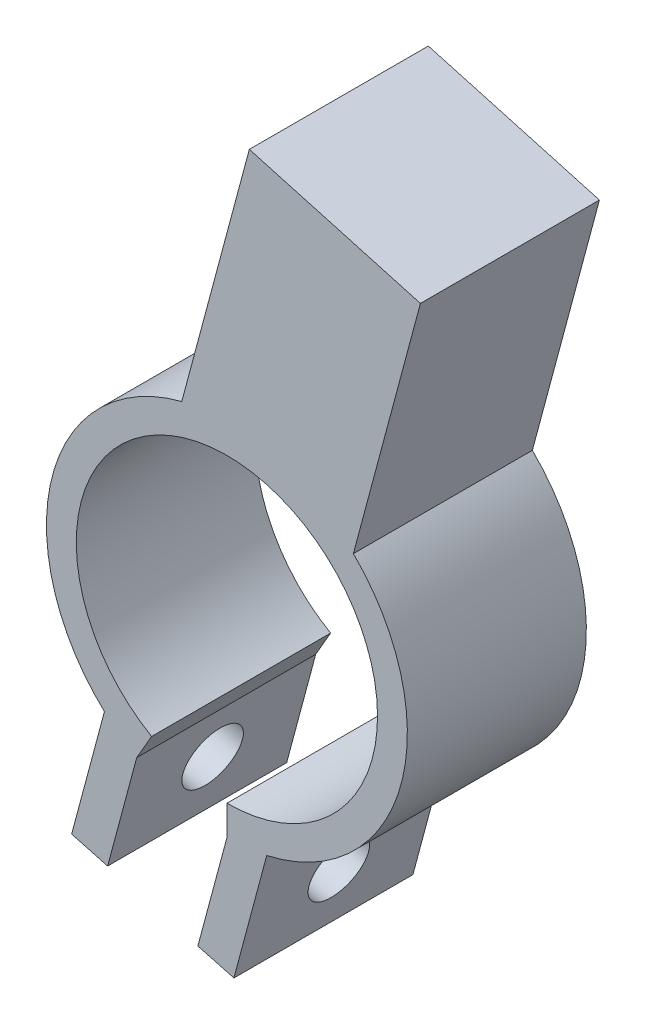
ISO-10303-21;
HEADER;
FILE_DESCRIPTION(('STEP AP214'),'2;1');
FILE_NAME('part.step','',(''),(''),'','','');
FILE_SCHEMA(('AUTOMOTIVE_DESIGN { 1 0 10303 214 1 1 1 1 }'));
ENDSEC;
DATA;
#1=APPLICATION_CONTEXT('core data for automotive mechanical design processes');
#2=APPLICATION_PROTOCOL_DEFINITION('international standard','automotive_design',2000,#1);
#3=PRODUCT_CONTEXT('',#1,'mechanical');
#4=PRODUCT('Part','Part','',(#3));
#5=PRODUCT_RELATED_PRODUCT_CATEGORY('part','',(#4));
#6=PRODUCT_DEFINITION_FORMATION('','',#4);
#7=PRODUCT_DEFINITION_CONTEXT('part definition',#1,'design');
#8=PRODUCT_DEFINITION('design','',#6,#7);
#9=PRODUCT_DEFINITION_SHAPE('','',#8);
#10=(LENGTH_UNIT() NAMED_UNIT(*) SI_UNIT(.MILLI.,.METRE.));
#11=(NAMED_UNIT(*) PLANE_ANGLE_UNIT() SI_UNIT($,.RADIAN.));
#12=(NAMED_UNIT(*) SI_UNIT($,.STERADIAN.) SOLID_ANGLE_UNIT());
#13=UNCERTAINTY_MEASURE_WITH_UNIT(LENGTH_MEASURE(1.E-05),#10,'distance_accuracy_value','');
#14=(GEOMETRIC_REPRESENTATION_CONTEXT(3) GLOBAL_UNCERTAINTY_ASSIGNED_CONTEXT((#13)) GLOBAL_UNIT_ASSIGNED_CONTEXT((#10,
#11,#12)) REPRESENTATION_CONTEXT('',''));
#15=CARTESIAN_POINT('',(0.,0.,0.));
#16=DIRECTION('',(0.,0.,1.));
#17=DIRECTION('',(1.,0.,0.));
#18=AXIS2_PLACEMENT_3D('',#15,#16,#17);
#19=CARTESIAN_POINT('',(0.,0.,24.));
#20=DIRECTION('',(0.,0.,-1.));
#21=DIRECTION('',(-1.,0.,0.));
#22=AXIS2_PLACEMENT_3D('',#19,#20,#21);
#23=CYLINDRICAL_SURFACE('',#22,24.193);
#24=CARTESIAN_POINT('',(0.,0.,0.));
#25=DIRECTION('',(0.,0.,1.));
#26=DIRECTION('',(1.,0.,0.));
#27=AXIS2_PLACEMENT_3D('',#24,#25,#26);
#28=CIRCLE('',#27,24.193);
#29=CARTESIAN_POINT('',(5.3360235923067,-23.5972053689064,0.));
#30=VERTEX_POINT('',#29);
#31=CARTESIAN_POINT('',(16.9534083986273,17.2592929365416,0.));
#32=VERTEX_POINT('',#31);
#33=EDGE_CURVE('E247',#30,#32,#28,.T.);
#34=ORIENTED_EDGE('',*,*,#33,.T.);
#35=DIRECTION('',(0.,0.,1.));
#36=VECTOR('',#35,1.);
#37=CARTESIAN_POINT('',(16.9534083986273,17.2592929365416,0.));
#38=LINE('',#37,#36);
#39=CARTESIAN_POINT('',(16.9534083986273,17.2592929365416,24.));
#40=VERTEX_POINT('',#39);
#41=EDGE_CURVE('E58',#32,#40,#38,.T.);
#42=ORIENTED_EDGE('',*,*,#41,.T.);
#43=CARTESIAN_POINT('',(0.,0.,24.));
#44=DIRECTION('',(0.,0.,1.));
#45=DIRECTION('',(1.,0.,0.));
#46=AXIS2_PLACEMENT_3D('',#43,#44,#45);
#47=CIRCLE('',#46,24.193);
#48=CARTESIAN_POINT('',(5.3360235923067,-23.5972053689064,24.));
#49=VERTEX_POINT('',#48);
#50=EDGE_CURVE('E245',#49,#40,#47,.T.);
#51=ORIENTED_EDGE('',*,*,#50,.F.);
#52=DIRECTION('',(0.,0.,1.));
#53=VECTOR('',#52,1.);
#54=CARTESIAN_POINT('',(5.3360235923067,-23.5972053689064,0.));
#55=LINE('',#54,#53);
#56=EDGE_CURVE('E196',#30,#49,#55,.T.);
#57=ORIENTED_EDGE('',*,*,#56,.F.);
#58=EDGE_LOOP('',(#34,#42,#51,#57));
#59=FACE_BOUND('',#58,.T.);
#60=ADVANCED_FACE('F34',(#59),#23,.T.);
#61=CARTESIAN_POINT('',(-6.05243588567291,23.423690333716,24.));
#62=VERTEX_POINT('',#61);
#63=CARTESIAN_POINT('',(-16.419734670584,-17.7677675116381,24.));
#64=VERTEX_POINT('',#63);
#65=EDGE_CURVE('E50',#62,#64,#47,.T.);
#66=ORIENTED_EDGE('',*,*,#65,.F.);
#67=DIRECTION('',(0.,0.,1.));
#68=VECTOR('',#67,1.);
#69=CARTESIAN_POINT('',(-6.05243588567286,23.423690333716,0.));
#70=LINE('',#69,#68);
#71=CARTESIAN_POINT('',(-6.05243588567286,23.423690333716,0.));
#72=VERTEX_POINT('',#71);
#73=EDGE_CURVE('E147',#72,#62,#70,.T.);
#74=ORIENTED_EDGE('',*,*,#73,.F.);
#75=CARTESIAN_POINT('',(-16.419734670584,-17.7677675116381,0.));
#76=VERTEX_POINT('',#75);
#77=EDGE_CURVE('E158',#72,#76,#28,.T.);
#78=ORIENTED_EDGE('',*,*,#77,.T.);
#79=DIRECTION('',(0.,0.,1.));
#80=VECTOR('',#79,1.);
#81=CARTESIAN_POINT('',(-16.419734670584,-17.7677675116381,0.));
#82=LINE('',#81,#80);
#83=EDGE_CURVE('E217',#76,#64,#82,.T.);
#84=ORIENTED_EDGE('',*,*,#83,.T.);
#85=EDGE_LOOP('',(#66,#74,#78,#84));
#86=FACE_BOUND('',#85,.T.);
#87=ADVANCED_FACE('F36',(#86),#23,.T.);
#88=CARTESIAN_POINT('',(0.,0.,24.));
#89=DIRECTION('',(0.,0.,1.));
#90=DIRECTION('',(1.,0.,0.));
#91=AXIS2_PLACEMENT_3D('',#88,#89,#90);
#92=PLANE('',#91);
#93=DIRECTION('',(-0.500000000000001,-0.866025403784438,0.));
#94=VECTOR('',#93,1.);
#95=CARTESIAN_POINT('',(-12.0965,-20.9517525937569,24.));
#96=LINE('',#95,#94);
#97=CARTESIAN_POINT('',(-10.0965,-17.4876509786192,24.));
#98=VERTEX_POINT('',#97);
#99=CARTESIAN_POINT('',(-12.0965,-20.9517525937569,24.));
#100=VERTEX_POINT('',#99);
#101=EDGE_CURVE('E229',#98,#100,#96,.T.);
#102=ORIENTED_EDGE('',*,*,#101,.F.);
#103=CARTESIAN_POINT('',(0.,0.,24.));
#104=DIRECTION('',(0.,0.,1.));
#105=DIRECTION('',(1.,0.,0.));
#106=AXIS2_PLACEMENT_3D('',#103,#104,#105);
#107=CIRCLE('',#106,20.193);
#108=CARTESIAN_POINT('',(0.,-20.193,24.));
#109=VERTEX_POINT('',#108);
#110=EDGE_CURVE('E241',#109,#98,#107,.T.);
#111=ORIENTED_EDGE('',*,*,#110,.F.);
#112=DIRECTION('',(0.,1.,0.));
#113=VECTOR('',#112,1.);
#114=CARTESIAN_POINT('',(0.,-24.193,24.));
#115=LINE('',#114,#113);
#116=CARTESIAN_POINT('',(0.,-24.193,24.));
#117=VERTEX_POINT('',#116);
#118=EDGE_CURVE('E219',#117,#109,#115,.T.);
#119=ORIENTED_EDGE('',*,*,#118,.F.);
#120=DIRECTION('',(0.258819045102521,0.965925826289068,0.));
#121=VECTOR('',#120,1.);
#122=CARTESIAN_POINT('',(6.04825000000001,-1.62062370312154,24.));
#123=LINE('',#122,#121);
#124=CARTESIAN_POINT('',(-3.89352930588146,-38.723849190308,24.));
#125=VERTEX_POINT('',#124);
#126=EDGE_CURVE('E183',#125,#117,#123,.T.);
#127=ORIENTED_EDGE('',*,*,#126,.F.);
#128=DIRECTION('',(-0.965925826289068,0.258819045102521,0.));
#129=VECTOR('',#128,1.);
#130=CARTESIAN_POINT('',(-9.94177930588146,-37.1032254871864,24.));
#131=LINE('',#130,#129);
#132=CARTESIAN_POINT('',(0.93609982556388,-40.0179444158206,24.));
#133=VERTEX_POINT('',#132);
#134=EDGE_CURVE('E193',#133,#125,#131,.T.);
#135=ORIENTED_EDGE('',*,*,#134,.F.);
#136=DIRECTION('',(-0.258819045102521,-0.965925826289068,0.));
#137=VECTOR('',#136,1.);
#138=CARTESIAN_POINT('',(10.8778791314454,-2.91471892863415,24.));
#139=LINE('',#138,#137);
#140=EDGE_CURVE('E187',#49,#133,#139,.T.);
#141=ORIENTED_EDGE('',*,*,#140,.F.);
#142=ORIENTED_EDGE('',*,*,#50,.T.);
#143=DIRECTION('',(0.258819045102521,0.965925826289069,0.));
#144=VECTOR('',#143,1.);
#145=CARTESIAN_POINT('',(11.5029221421501,-3.0821986985872,24.));
#146=LINE('',#145,#144);
#147=CARTESIAN_POINT('',(25.9448975350987,50.8159872295567,24.));
#148=VERTEX_POINT('',#147);
#149=EDGE_CURVE('E162',#40,#148,#146,.T.);
#150=ORIENTED_EDGE('',*,*,#149,.T.);
#151=DIRECTION('',(-0.963048123550822,0.269329374048286,0.));
#152=VECTOR('',#151,1.);
#153=CARTESIAN_POINT('',(15.0625049204434,53.8593948427154,24.));
#154=LINE('',#153,#152);
#155=CARTESIAN_POINT('',(3.00623069291536,57.2310942538334,24.));
#156=VERTEX_POINT('',#155);
#157=EDGE_CURVE('E168',#148,#156,#154,.T.);
#158=ORIENTED_EDGE('',*,*,#157,.T.);
#159=DIRECTION('',(-0.258819045102521,-0.965925826289069,0.));
#160=VECTOR('',#159,1.);
#161=CARTESIAN_POINT('',(-11.5029221421501,3.08219869858722,24.));
#162=LINE('',#161,#160);
#163=EDGE_CURVE('E142',#156,#62,#162,.T.);
#164=ORIENTED_EDGE('',*,*,#163,.T.);
#165=ORIENTED_EDGE('',*,*,#65,.T.);
#166=DIRECTION('',(0.258819045102521,0.965925826289068,0.));
#167=VECTOR('',#166,1.);
#168=CARTESIAN_POINT('',(-10.8778791314454,2.91471892863415,24.));
#169=LINE('',#168,#167);
#170=CARTESIAN_POINT('',(-20.8196584373268,-34.1885065585523,24.));
#171=VERTEX_POINT('',#170);
#172=EDGE_CURVE('E198',#171,#64,#169,.T.);
#173=ORIENTED_EDGE('',*,*,#172,.F.);
#174=DIRECTION('',(-0.965925826289068,0.258819045102521,0.));
#175=VECTOR('',#174,1.);
#176=CARTESIAN_POINT('',(-9.94177930588146,-37.1032254871864,24.));
#177=LINE('',#176,#175);
#178=CARTESIAN_POINT('',(-15.9900293058815,-35.4826017840649,24.));
#179=VERTEX_POINT('',#178);
#180=EDGE_CURVE('E214',#179,#171,#177,.T.);
#181=ORIENTED_EDGE('',*,*,#180,.F.);
#182=DIRECTION('',(-0.258819045102521,-0.965925826289068,0.));
#183=VECTOR('',#182,1.);
#184=CARTESIAN_POINT('',(-6.04825000000001,1.62062370312154,24.));
#185=LINE('',#184,#183);
#186=EDGE_CURVE('E207',#100,#179,#185,.T.);
#187=ORIENTED_EDGE('',*,*,#186,.F.);
#188=EDGE_LOOP('',(#102,#111,#119,#127,#135,#141,#142,#150,#158,#164,#165,#173,#181,#187));
#189=FACE_BOUND('',#188,.T.);
#190=ADVANCED_FACE('F266',(#189),#92,.T.);
#191=CARTESIAN_POINT('',(0.,0.,0.));
#192=DIRECTION('',(0.,0.,1.));
#193=DIRECTION('',(1.,0.,0.));
#194=AXIS2_PLACEMENT_3D('',#191,#192,#193);
#195=PLANE('',#194);
#196=CARTESIAN_POINT('',(0.,0.,0.));
#197=DIRECTION('',(0.,0.,1.));
#198=DIRECTION('',(1.,0.,0.));
#199=AXIS2_PLACEMENT_3D('',#196,#197,#198);
#200=CIRCLE('',#199,20.193);
#201=CARTESIAN_POINT('',(0.,-20.193,0.));
#202=VERTEX_POINT('',#201);
#203=CARTESIAN_POINT('',(-10.0965,-17.4876509786192,0.));
#204=VERTEX_POINT('',#203);
#205=EDGE_CURVE('E238',#202,#204,#200,.T.);
#206=ORIENTED_EDGE('',*,*,#205,.T.);
#207=DIRECTION('',(-0.500000000000001,-0.866025403784438,0.));
#208=VECTOR('',#207,1.);
#209=CARTESIAN_POINT('',(-12.0965,-20.9517525937569,0.));
#210=LINE('',#209,#208);
#211=CARTESIAN_POINT('',(-12.0965,-20.9517525937569,0.));
#212=VERTEX_POINT('',#211);
#213=EDGE_CURVE('E228',#204,#212,#210,.T.);
#214=ORIENTED_EDGE('',*,*,#213,.T.);
#215=DIRECTION('',(-0.258819045102521,-0.965925826289068,0.));
#216=VECTOR('',#215,1.);
#217=CARTESIAN_POINT('',(-6.04825000000001,1.62062370312154,0.));
#218=LINE('',#217,#216);
#219=CARTESIAN_POINT('',(-15.9900293058815,-35.4826017840649,0.));
#220=VERTEX_POINT('',#219);
#221=EDGE_CURVE('E209',#212,#220,#218,.T.);
#222=ORIENTED_EDGE('',*,*,#221,.T.);
#223=DIRECTION('',(-0.965925826289068,0.258819045102521,0.));
#224=VECTOR('',#223,1.);
#225=CARTESIAN_POINT('',(-9.94177930588146,-37.1032254871864,0.));
#226=LINE('',#225,#224);
#227=CARTESIAN_POINT('',(-20.8196584373268,-34.1885065585523,0.));
#228=VERTEX_POINT('',#227);
#229=EDGE_CURVE('E206',#220,#228,#226,.T.);
#230=ORIENTED_EDGE('',*,*,#229,.T.);
#231=DIRECTION('',(0.258819045102521,0.965925826289068,0.));
#232=VECTOR('',#231,1.);
#233=CARTESIAN_POINT('',(-10.8778791314454,2.91471892863415,0.));
#234=LINE('',#233,#232);
#235=EDGE_CURVE('E204',#228,#76,#234,.T.);
#236=ORIENTED_EDGE('',*,*,#235,.T.);
#237=ORIENTED_EDGE('',*,*,#77,.F.);
#238=DIRECTION('',(-0.258819045102521,-0.965925826289069,0.));
#239=VECTOR('',#238,1.);
#240=CARTESIAN_POINT('',(-11.5029221421501,3.08219869858722,0.));
#241=LINE('',#240,#239);
#242=CARTESIAN_POINT('',(3.00623069291536,57.2310942538334,0.));
#243=VERTEX_POINT('',#242);
#244=EDGE_CURVE('E140',#243,#72,#241,.T.);
#245=ORIENTED_EDGE('',*,*,#244,.F.);
#246=DIRECTION('',(-0.963048123550822,0.269329374048286,0.));
#247=VECTOR('',#246,1.);
#248=CARTESIAN_POINT('',(15.0625049204434,53.8593948427154,0.));
#249=LINE('',#248,#247);
#250=CARTESIAN_POINT('',(25.9448975350987,50.8159872295567,0.));
#251=VERTEX_POINT('',#250);
#252=EDGE_CURVE('E155',#251,#243,#249,.T.);
#253=ORIENTED_EDGE('',*,*,#252,.F.);
#254=DIRECTION('',(0.258819045102521,0.965925826289069,0.));
#255=VECTOR('',#254,1.);
#256=CARTESIAN_POINT('',(11.5029221421501,-3.0821986985872,0.));
#257=LINE('',#256,#255);
#258=EDGE_CURVE('E148',#32,#251,#257,.T.);
#259=ORIENTED_EDGE('',*,*,#258,.F.);
#260=ORIENTED_EDGE('',*,*,#33,.F.);
#261=DIRECTION('',(-0.258819045102521,-0.965925826289068,0.));
#262=VECTOR('',#261,1.);
#263=CARTESIAN_POINT('',(10.8778791314454,-2.91471892863415,0.));
#264=LINE('',#263,#262);
#265=CARTESIAN_POINT('',(0.93609982556388,-40.0179444158206,0.));
#266=VERTEX_POINT('',#265);
#267=EDGE_CURVE('E189',#30,#266,#264,.T.);
#268=ORIENTED_EDGE('',*,*,#267,.T.);
#269=DIRECTION('',(-0.965925826289068,0.258819045102521,0.));
#270=VECTOR('',#269,1.);
#271=CARTESIAN_POINT('',(-9.94177930588146,-37.1032254871864,0.));
#272=LINE('',#271,#270);
#273=CARTESIAN_POINT('',(-3.89352930588146,-38.723849190308,0.));
#274=VERTEX_POINT('',#273);
#275=EDGE_CURVE('E186',#266,#274,#272,.T.);
#276=ORIENTED_EDGE('',*,*,#275,.T.);
#277=DIRECTION('',(0.258819045102521,0.965925826289068,0.));
#278=VECTOR('',#277,1.);
#279=CARTESIAN_POINT('',(6.04825000000001,-1.62062370312154,0.));
#280=LINE('',#279,#278);
#281=CARTESIAN_POINT('',(0.,-24.193,0.));
#282=VERTEX_POINT('',#281);
#283=EDGE_CURVE('E184',#274,#282,#280,.T.);
#284=ORIENTED_EDGE('',*,*,#283,.T.);
#285=DIRECTION('',(0.,1.,0.));
#286=VECTOR('',#285,1.);
#287=CARTESIAN_POINT('',(0.,-24.193,0.));
#288=LINE('',#287,#286);
#289=EDGE_CURVE('E225',#282,#202,#288,.T.);
#290=ORIENTED_EDGE('',*,*,#289,.T.);
#291=EDGE_LOOP('',(#206,#214,#222,#230,#236,#237,#245,#253,#259,#260,#268,#276,#284,#290));
#292=FACE_BOUND('',#291,.T.);
#293=ADVANCED_FACE('F153',(#292),#195,.F.);
#294=CARTESIAN_POINT('',(0.,0.,24.));
#295=DIRECTION('',(0.,0.,-1.));
#296=DIRECTION('',(-1.,0.,0.));
#297=AXIS2_PLACEMENT_3D('',#294,#295,#296);
#298=CYLINDRICAL_SURFACE('',#297,20.193);
#299=DIRECTION('',(0.,0.,-1.));
#300=VECTOR('',#299,1.);
#301=CARTESIAN_POINT('',(-10.0965,-17.4876509786192,24.));
#302=LINE('',#301,#300);
#303=EDGE_CURVE('E11',#204,#98,#302,.F.);
#304=ORIENTED_EDGE('',*,*,#303,.F.);
#305=ORIENTED_EDGE('',*,*,#205,.F.);
#306=DIRECTION('',(0.,0.,-1.));
#307=VECTOR('',#306,1.);
#308=CARTESIAN_POINT('',(0.,-20.193,24.));
#309=LINE('',#308,#307);
#310=EDGE_CURVE('E43',#109,#202,#309,.T.);
#311=ORIENTED_EDGE('',*,*,#310,.F.);
#312=ORIENTED_EDGE('',*,*,#110,.T.);
#313=EDGE_LOOP('',(#304,#305,#311,#312));
#314=FACE_BOUND('',#313,.T.);
#315=ADVANCED_FACE('F260',(#314),#298,.F.);
#316=CARTESIAN_POINT('',(0.,-24.193,0.));
#317=DIRECTION('',(1.,0.,0.));
#318=DIRECTION('',(0.,0.,-1.));
#319=AXIS2_PLACEMENT_3D('',#316,#317,#318);
#320=PLANE('',#319);
#321=ORIENTED_EDGE('',*,*,#310,.T.);
#322=ORIENTED_EDGE('',*,*,#289,.F.);
#323=DIRECTION('',(0.,0.,1.));
#324=VECTOR('',#323,1.);
#325=CARTESIAN_POINT('',(0.,-24.193,0.));
#326=LINE('',#325,#324);
#327=EDGE_CURVE('E232',#282,#117,#326,.T.);
#328=ORIENTED_EDGE('',*,*,#327,.T.);
#329=ORIENTED_EDGE('',*,*,#118,.T.);
#330=EDGE_LOOP('',(#321,#322,#328,#329));
#331=FACE_BOUND('',#330,.T.);
#332=ADVANCED_FACE('F252',(#331),#320,.F.);
#333=CARTESIAN_POINT('',(-12.0965,-20.9517525937569,0.));
#334=DIRECTION('',(-0.866025403784438,0.500000000000001,0.));
#335=DIRECTION('',(-0.500000000000001,-0.866025403784438,0.));
#336=AXIS2_PLACEMENT_3D('',#333,#334,#335);
#337=PLANE('',#336);
#338=ORIENTED_EDGE('',*,*,#303,.T.);
#339=ORIENTED_EDGE('',*,*,#101,.T.);
#340=DIRECTION('',(0.,0.,1.));
#341=VECTOR('',#340,1.);
#342=CARTESIAN_POINT('',(-12.0965,-20.9517525937569,0.));
#343=LINE('',#342,#341);
#344=EDGE_CURVE('E235',#212,#100,#343,.T.);
#345=ORIENTED_EDGE('',*,*,#344,.F.);
#346=ORIENTED_EDGE('',*,*,#213,.F.);
#347=EDGE_LOOP('',(#338,#339,#345,#346));
#348=FACE_BOUND('',#347,.T.);
#349=ADVANCED_FACE('F263',(#348),#337,.F.);
#350=CARTESIAN_POINT('',(-10.8778791314454,2.91471892863415,0.));
#351=DIRECTION('',(0.965925826289068,-0.258819045102521,0.));
#352=DIRECTION('',(0.258819045102521,0.965925826289068,0.));
#353=AXIS2_PLACEMENT_3D('',#350,#351,#352);
#354=PLANE('',#353);
#355=CARTESIAN_POINT('',(-18.7491060765067,-26.4610999482397,12.));
#356=DIRECTION('',(-0.965925826289068,0.258819045102521,0.));
#357=DIRECTION('',(-0.258819045102521,-0.965925826289068,0.));
#358=AXIS2_PLACEMENT_3D('',#355,#356,#357);
#359=CIRCLE('',#358,4.);
#360=CARTESIAN_POINT('',(-19.7843822569167,-30.324803253396,12.));
#361=VERTEX_POINT('',#360);
#362=EDGE_CURVE('E172',#361,#361,#359,.T.);
#363=ORIENTED_EDGE('',*,*,#362,.F.);
#364=EDGE_LOOP('',(#363));
#365=FACE_BOUND('',#364,.T.);
#366=ORIENTED_EDGE('',*,*,#172,.T.);
#367=ORIENTED_EDGE('',*,*,#83,.F.);
#368=ORIENTED_EDGE('',*,*,#235,.F.);
#369=DIRECTION('',(0.,0.,1.));
#370=VECTOR('',#369,1.);
#371=CARTESIAN_POINT('',(-20.8196584373268,-34.1885065585523,0.));
#372=LINE('',#371,#370);
#373=EDGE_CURVE('E211',#228,#171,#372,.T.);
#374=ORIENTED_EDGE('',*,*,#373,.T.);
#375=EDGE_LOOP('',(#366,#367,#368,#374));
#376=FACE_BOUND('',#375,.T.);
#377=ADVANCED_FACE('F280',(#365,#376),#354,.F.);
#378=CARTESIAN_POINT('',(-6.04825000000001,1.62062370312154,0.));
#379=DIRECTION('',(-0.965925826289068,0.258819045102521,0.));
#380=DIRECTION('',(-0.258819045102521,-0.965925826289068,0.));
#381=AXIS2_PLACEMENT_3D('',#378,#379,#380);
#382=PLANE('',#381);
#383=CARTESIAN_POINT('',(-13.9194769450613,-27.7551951737523,12.));
#384=DIRECTION('',(-0.965925826289068,0.258819045102521,0.));
#385=DIRECTION('',(-0.258819045102521,-0.965925826289068,0.));
#386=AXIS2_PLACEMENT_3D('',#383,#384,#385);
#387=CIRCLE('',#386,4.);
#388=CARTESIAN_POINT('',(-14.9547531254714,-31.6188984789086,12.));
#389=VERTEX_POINT('',#388);
#390=EDGE_CURVE('E180',#389,#389,#387,.T.);
#391=ORIENTED_EDGE('',*,*,#390,.T.);
#392=EDGE_LOOP('',(#391));
#393=FACE_BOUND('',#392,.T.);
#394=ORIENTED_EDGE('',*,*,#186,.T.);
#395=DIRECTION('',(0.,0.,1.));
#396=VECTOR('',#395,1.);
#397=CARTESIAN_POINT('',(-15.9900293058815,-35.4826017840649,0.));
#398=LINE('',#397,#396);
#399=EDGE_CURVE('E220',#220,#179,#398,.T.);
#400=ORIENTED_EDGE('',*,*,#399,.F.);
#401=ORIENTED_EDGE('',*,*,#221,.F.);
#402=ORIENTED_EDGE('',*,*,#344,.T.);
#403=EDGE_LOOP('',(#394,#400,#401,#402));
#404=FACE_BOUND('',#403,.T.);
#405=ADVANCED_FACE('F271',(#393,#404),#382,.F.);
#406=CARTESIAN_POINT('',(-9.94177930588146,-37.1032254871864,0.));
#407=DIRECTION('',(0.258819045102521,0.965925826289068,0.));
#408=DIRECTION('',(-0.965925826289068,0.258819045102521,0.));
#409=AXIS2_PLACEMENT_3D('',#406,#407,#408);
#410=PLANE('',#409);
#411=ORIENTED_EDGE('',*,*,#180,.T.);
#412=ORIENTED_EDGE('',*,*,#373,.F.);
#413=ORIENTED_EDGE('',*,*,#229,.F.);
#414=ORIENTED_EDGE('',*,*,#399,.T.);
#415=EDGE_LOOP('',(#411,#412,#413,#414));
#416=FACE_BOUND('',#415,.T.);
#417=ADVANCED_FACE('F275',(#416),#410,.F.);
#418=CARTESIAN_POINT('',(6.04825000000001,-1.62062370312154,0.));
#419=DIRECTION('',(0.965925826289068,-0.258819045102521,0.));
#420=DIRECTION('',(0.258819045102521,0.965925826289068,0.));
#421=AXIS2_PLACEMENT_3D('',#418,#419,#420);
#422=PLANE('',#421);
#423=CARTESIAN_POINT('',(-1.82297694506129,-30.9964425799954,12.));
#424=DIRECTION('',(0.965925826289068,-0.258819045102521,0.));
#425=DIRECTION('',(0.258819045102521,0.965925826289068,0.));
#426=AXIS2_PLACEMENT_3D('',#423,#424,#425);
#427=CIRCLE('',#426,4.);
#428=CARTESIAN_POINT('',(-0.78770076465121,-27.1327392748392,12.));
#429=VERTEX_POINT('',#428);
#430=EDGE_CURVE('E177',#429,#429,#427,.T.);
#431=ORIENTED_EDGE('',*,*,#430,.T.);
#432=EDGE_LOOP('',(#431));
#433=FACE_BOUND('',#432,.T.);
#434=ORIENTED_EDGE('',*,*,#126,.T.);
#435=ORIENTED_EDGE('',*,*,#327,.F.);
#436=ORIENTED_EDGE('',*,*,#283,.F.);
#437=DIRECTION('',(0.,0.,1.));
#438=VECTOR('',#437,1.);
#439=CARTESIAN_POINT('',(-3.89352930588146,-38.723849190308,0.));
#440=LINE('',#439,#438);
#441=EDGE_CURVE('E191',#274,#125,#440,.T.);
#442=ORIENTED_EDGE('',*,*,#441,.T.);
#443=EDGE_LOOP('',(#434,#435,#436,#442));
#444=FACE_BOUND('',#443,.T.);
#445=ADVANCED_FACE('F297',(#433,#444),#422,.F.);
#446=CARTESIAN_POINT('',(10.8778791314454,-2.91471892863415,0.));
#447=DIRECTION('',(-0.965925826289068,0.258819045102521,0.));
#448=DIRECTION('',(-0.258819045102521,-0.965925826289068,0.));
#449=AXIS2_PLACEMENT_3D('',#446,#447,#448);
#450=PLANE('',#449);
#451=CARTESIAN_POINT('',(3.00665218638405,-32.290537805508,12.));
#452=DIRECTION('',(-0.965925826289068,0.258819045102521,0.));
#453=DIRECTION('',(-0.258819045102521,-0.965925826289068,0.));
#454=AXIS2_PLACEMENT_3D('',#451,#452,#453);
#455=CIRCLE('',#454,4.);
#456=CARTESIAN_POINT('',(1.97137600597396,-36.1542411106643,12.));
#457=VERTEX_POINT('',#456);
#458=EDGE_CURVE('E38',#457,#457,#455,.T.);
#459=ORIENTED_EDGE('',*,*,#458,.T.);
#460=EDGE_LOOP('',(#459));
#461=FACE_BOUND('',#460,.T.);
#462=ORIENTED_EDGE('',*,*,#140,.T.);
#463=DIRECTION('',(0.,0.,1.));
#464=VECTOR('',#463,1.);
#465=CARTESIAN_POINT('',(0.93609982556388,-40.0179444158206,0.));
#466=LINE('',#465,#464);
#467=EDGE_CURVE('E199',#266,#133,#466,.T.);
#468=ORIENTED_EDGE('',*,*,#467,.F.);
#469=ORIENTED_EDGE('',*,*,#267,.F.);
#470=ORIENTED_EDGE('',*,*,#56,.T.);
#471=EDGE_LOOP('',(#462,#468,#469,#470));
#472=FACE_BOUND('',#471,.T.);
#473=ADVANCED_FACE('F289',(#461,#472),#450,.F.);
#474=CARTESIAN_POINT('',(-9.94177930588146,-37.1032254871864,0.));
#475=DIRECTION('',(0.258819045102521,0.965925826289068,0.));
#476=DIRECTION('',(-0.965925826289068,0.258819045102521,0.));
#477=AXIS2_PLACEMENT_3D('',#474,#475,#476);
#478=PLANE('',#477);
#479=ORIENTED_EDGE('',*,*,#134,.T.);
#480=ORIENTED_EDGE('',*,*,#441,.F.);
#481=ORIENTED_EDGE('',*,*,#275,.F.);
#482=ORIENTED_EDGE('',*,*,#467,.T.);
#483=EDGE_LOOP('',(#479,#480,#481,#482));
#484=FACE_BOUND('',#483,.T.);
#485=ADVANCED_FACE('F294',(#484),#478,.F.);
#486=CARTESIAN_POINT('',(4.43311375443099,-32.6727570307003,12.));
#487=DIRECTION('',(-0.965925826289068,0.258819045102521,0.));
#488=DIRECTION('',(-0.258819045102521,-0.965925826289068,0.));
#489=AXIS2_PLACEMENT_3D('',#486,#487,#488);
#490=CYLINDRICAL_SURFACE('',#489,4.);
#491=ORIENTED_EDGE('',*,*,#458,.F.);
#492=EDGE_LOOP('',(#491));
#493=FACE_BOUND('',#492,.T.);
#494=ORIENTED_EDGE('',*,*,#430,.F.);
#495=EDGE_LOOP('',(#494));
#496=FACE_BOUND('',#495,.T.);
#497=ADVANCED_FACE('F338',(#493,#496),#490,.F.);
#498=ORIENTED_EDGE('',*,*,#362,.T.);
#499=EDGE_LOOP('',(#498));
#500=FACE_BOUND('',#499,.T.);
#501=ORIENTED_EDGE('',*,*,#390,.F.);
#502=EDGE_LOOP('',(#501));
#503=FACE_BOUND('',#502,.T.);
#504=ADVANCED_FACE('F336',(#500,#503),#490,.F.);
#505=CARTESIAN_POINT('',(15.0625049204434,53.8593948427154,0.));
#506=DIRECTION('',(0.269329374048286,0.963048123550821,0.));
#507=DIRECTION('',(-0.963048123550822,0.269329374048286,0.));
#508=AXIS2_PLACEMENT_3D('',#505,#506,#507);
#509=PLANE('',#508);
#510=ORIENTED_EDGE('',*,*,#157,.F.);
#511=DIRECTION('',(0.,0.,1.));
#512=VECTOR('',#511,1.);
#513=CARTESIAN_POINT('',(25.9448975350987,50.8159872295567,0.));
#514=LINE('',#513,#512);
#515=EDGE_CURVE('E161',#251,#148,#514,.T.);
#516=ORIENTED_EDGE('',*,*,#515,.F.);
#517=ORIENTED_EDGE('',*,*,#252,.T.);
#518=DIRECTION('',(0.,0.,1.));
#519=VECTOR('',#518,1.);
#520=CARTESIAN_POINT('',(3.00623069291536,57.2310942538334,0.));
#521=LINE('',#520,#519);
#522=EDGE_CURVE('E137',#243,#156,#521,.T.);
#523=ORIENTED_EDGE('',*,*,#522,.T.);
#524=EDGE_LOOP('',(#510,#516,#517,#523));
#525=FACE_BOUND('',#524,.T.);
#526=ADVANCED_FACE('F160',(#525),#509,.T.);
#527=CARTESIAN_POINT('',(11.5029221421501,-3.0821986985872,0.));
#528=DIRECTION('',(0.965925826289068,-0.258819045102521,0.));
#529=DIRECTION('',(0.258819045102521,0.965925826289068,0.));
#530=AXIS2_PLACEMENT_3D('',#527,#528,#529);
#531=PLANE('',#530);
#532=ORIENTED_EDGE('',*,*,#149,.F.);
#533=ORIENTED_EDGE('',*,*,#41,.F.);
#534=ORIENTED_EDGE('',*,*,#258,.T.);
#535=ORIENTED_EDGE('',*,*,#515,.T.);
#536=EDGE_LOOP('',(#532,#533,#534,#535));
#537=FACE_BOUND('',#536,.T.);
#538=ADVANCED_FACE('F284',(#537),#531,.T.);
#539=CARTESIAN_POINT('',(-11.5029221421501,3.08219869858722,0.));
#540=DIRECTION('',(-0.965925826289068,0.258819045102521,0.));
#541=DIRECTION('',(-0.258819045102521,-0.965925826289068,0.));
#542=AXIS2_PLACEMENT_3D('',#539,#540,#541);
#543=PLANE('',#542);
#544=ORIENTED_EDGE('',*,*,#163,.F.);
#545=ORIENTED_EDGE('',*,*,#522,.F.);
#546=ORIENTED_EDGE('',*,*,#244,.T.);
#547=ORIENTED_EDGE('',*,*,#73,.T.);
#548=EDGE_LOOP('',(#544,#545,#546,#547));
#549=FACE_BOUND('',#548,.T.);
#550=ADVANCED_FACE('F139',(#549),#543,.T.);
#551=CLOSED_SHELL('',(#60,#87,#190,#293,#315,#332,#349,#377,#405,#417,#445,#473,#485,#497,#504,
#526,#538,#550));
#552=MANIFOLD_SOLID_BREP('B2',#551);
#553=ADVANCED_BREP_SHAPE_REPRESENTATION('',(#18,#552),#14);
#554=SHAPE_DEFINITION_REPRESENTATION(#9,#553);
ENDSEC;
END-ISO-10303-21;
